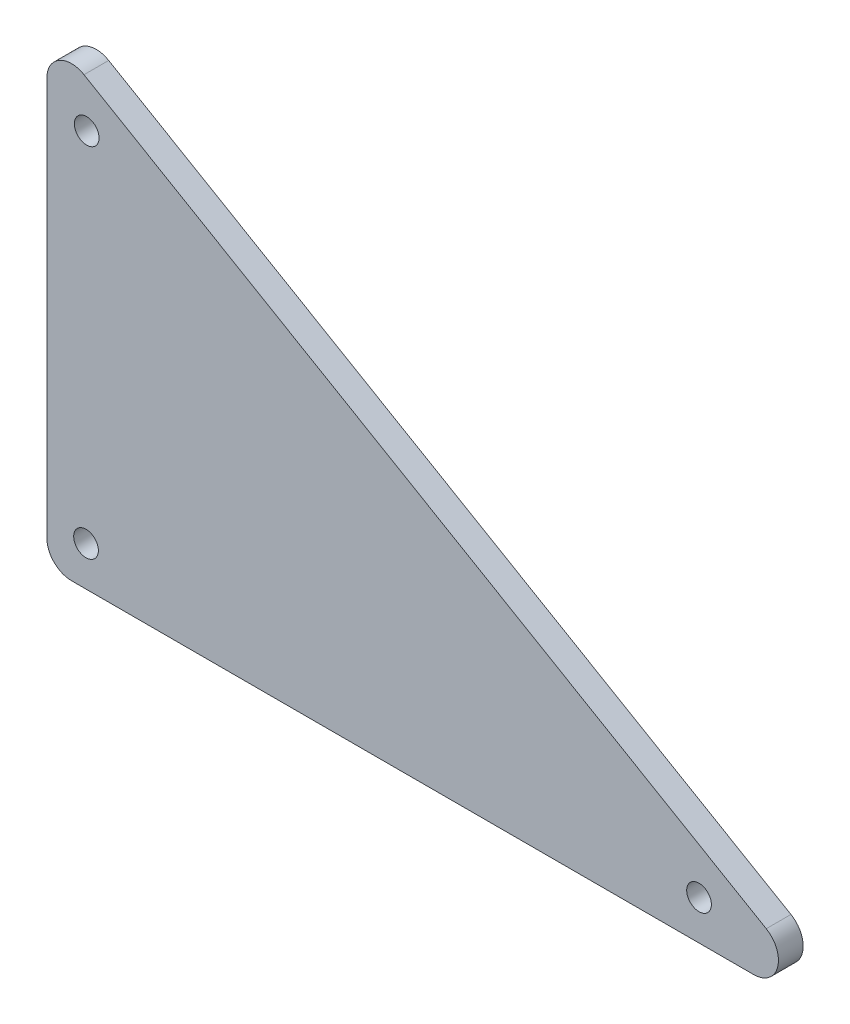
ISO-10303-21;
HEADER;
FILE_DESCRIPTION(('STEP AP214'),'2;1');
FILE_NAME('part.step','',(''),(''),'','','');
FILE_SCHEMA(('AUTOMOTIVE_DESIGN { 1 0 10303 214 1 1 1 1 }'));
ENDSEC;
DATA;
#1=APPLICATION_CONTEXT('core data for automotive mechanical design processes');
#2=APPLICATION_PROTOCOL_DEFINITION('international standard','automotive_design',2000,#1);
#3=PRODUCT_CONTEXT('',#1,'mechanical');
#4=PRODUCT('Part','Part','',(#3));
#5=PRODUCT_RELATED_PRODUCT_CATEGORY('part','',(#4));
#6=PRODUCT_DEFINITION_FORMATION('','',#4);
#7=PRODUCT_DEFINITION_CONTEXT('part definition',#1,'design');
#8=PRODUCT_DEFINITION('design','',#6,#7);
#9=PRODUCT_DEFINITION_SHAPE('','',#8);
#10=(LENGTH_UNIT() NAMED_UNIT(*) SI_UNIT(.MILLI.,.METRE.));
#11=(NAMED_UNIT(*) PLANE_ANGLE_UNIT() SI_UNIT($,.RADIAN.));
#12=(NAMED_UNIT(*) SI_UNIT($,.STERADIAN.) SOLID_ANGLE_UNIT());
#13=UNCERTAINTY_MEASURE_WITH_UNIT(LENGTH_MEASURE(1.E-05),#10,'distance_accuracy_value','');
#14=(GEOMETRIC_REPRESENTATION_CONTEXT(3) GLOBAL_UNCERTAINTY_ASSIGNED_CONTEXT((#13)) GLOBAL_UNIT_ASSIGNED_CONTEXT((#10,
#11,#12)) REPRESENTATION_CONTEXT('',''));
#15=CARTESIAN_POINT('',(0.,0.,0.));
#16=DIRECTION('',(0.,0.,1.));
#17=DIRECTION('',(1.,0.,0.));
#18=AXIS2_PLACEMENT_3D('',#15,#16,#17);
#19=CARTESIAN_POINT('',(0.,0.,5.));
#20=DIRECTION('',(0.,0.,1.));
#21=DIRECTION('',(1.,0.,0.));
#22=AXIS2_PLACEMENT_3D('',#19,#20,#21);
#23=PLANE('',#22);
#24=CARTESIAN_POINT('',(-73.2752494825146,-43.9732804687067,5.));
#25=DIRECTION('',(0.,0.,1.));
#26=DIRECTION('',(1.,0.,0.));
#27=AXIS2_PLACEMENT_3D('',#24,#25,#26);
#28=CIRCLE('',#27,2.50000000000001);
#29=CARTESIAN_POINT('',(-70.7752494825146,-43.9732804687067,5.));
#30=VERTEX_POINT('',#29);
#31=EDGE_CURVE('E283',#30,#30,#28,.T.);
#32=ORIENTED_EDGE('',*,*,#31,.F.);
#33=EDGE_LOOP('',(#32));
#34=FACE_BOUND('',#33,.T.);
#35=DIRECTION('',(0.,-1.,0.));
#36=VECTOR('',#35,1.);
#37=CARTESIAN_POINT('',(-81.2087316427934,-51.9739675162871,5.));
#38=LINE('',#37,#36);
#39=CARTESIAN_POINT('',(-81.2087316427934,33.7220519318444,5.));
#40=VERTEX_POINT('',#39);
#41=CARTESIAN_POINT('',(-81.2087316427934,-46.9739675162871,5.));
#42=VERTEX_POINT('',#41);
#43=EDGE_CURVE('E121',#40,#42,#38,.T.);
#44=ORIENTED_EDGE('',*,*,#43,.T.);
#45=CARTESIAN_POINT('',(-76.2087316427934,-46.9739675162871,5.));
#46=DIRECTION('',(0.,0.,1.));
#47=DIRECTION('',(1.,0.,0.));
#48=AXIS2_PLACEMENT_3D('',#45,#46,#47);
#49=CIRCLE('',#48,5.);
#50=CARTESIAN_POINT('',(-76.2087316427934,-51.9739675162871,5.));
#51=VERTEX_POINT('',#50);
#52=EDGE_CURVE('E137',#42,#51,#49,.T.);
#53=ORIENTED_EDGE('',*,*,#52,.T.);
#54=DIRECTION('',(1.,0.,0.));
#55=VECTOR('',#54,1.);
#56=CARTESIAN_POINT('',(80.4246140167158,-51.9739675162872,5.));
#57=LINE('',#56,#55);
#58=CARTESIAN_POINT('',(61.9504345109476,-51.9739675162872,5.));
#59=VERTEX_POINT('',#58);
#60=EDGE_CURVE('E111',#51,#59,#57,.T.);
#61=ORIENTED_EDGE('',*,*,#60,.T.);
#62=CARTESIAN_POINT('',(61.9504345109476,-46.9739675162872,5.));
#63=DIRECTION('',(0.,0.,1.));
#64=DIRECTION('',(1.,0.,0.));
#65=AXIS2_PLACEMENT_3D('',#62,#63,#64);
#66=CIRCLE('',#65,5.);
#67=CARTESIAN_POINT('',(64.4721948340449,-42.6564769404026,5.));
#68=VERTEX_POINT('',#67);
#69=EDGE_CURVE('E59',#59,#68,#66,.T.);
#70=ORIENTED_EDGE('',*,*,#69,.T.);
#71=DIRECTION('',(-0.86349811517692,0.504352064619455,0.));
#72=VECTOR('',#71,1.);
#73=CARTESIAN_POINT('',(-81.2087316427934,42.4328530220774,5.));
#74=LINE('',#73,#72);
#75=CARTESIAN_POINT('',(-73.6869713196961,38.039542507729,5.));
#76=VERTEX_POINT('',#75);
#77=EDGE_CURVE('E127',#68,#76,#74,.T.);
#78=ORIENTED_EDGE('',*,*,#77,.T.);
#79=CARTESIAN_POINT('',(-76.2087316427934,33.7220519318444,5.));
#80=DIRECTION('',(0.,0.,1.));
#81=DIRECTION('',(1.,0.,0.));
#82=AXIS2_PLACEMENT_3D('',#79,#80,#81);
#83=CIRCLE('',#82,5.);
#84=EDGE_CURVE('E134',#76,#40,#83,.T.);
#85=ORIENTED_EDGE('',*,*,#84,.T.);
#86=EDGE_LOOP('',(#44,#53,#61,#70,#78,#85));
#87=FACE_BOUND('',#86,.T.);
#88=CARTESIAN_POINT('',(-73.1422138030721,28.4567195312933,5.));
#89=DIRECTION('',(0.,0.,1.));
#90=DIRECTION('',(1.,0.,0.));
#91=AXIS2_PLACEMENT_3D('',#88,#89,#90);
#92=CIRCLE('',#91,2.50000000000001);
#93=CARTESIAN_POINT('',(-70.6422138030721,28.4567195312933,5.));
#94=VERTEX_POINT('',#93);
#95=EDGE_CURVE('E123',#94,#94,#92,.T.);
#96=ORIENTED_EDGE('',*,*,#95,.F.);
#97=EDGE_LOOP('',(#96));
#98=FACE_BOUND('',#97,.T.);
#99=CARTESIAN_POINT('',(50.8647505174854,-43.9732804687067,5.));
#100=DIRECTION('',(0.,0.,1.));
#101=DIRECTION('',(1.,0.,0.));
#102=AXIS2_PLACEMENT_3D('',#99,#100,#101);
#103=CIRCLE('',#102,2.5);
#104=CARTESIAN_POINT('',(53.3647505174854,-43.9732804687067,5.));
#105=VERTEX_POINT('',#104);
#106=EDGE_CURVE('E274',#105,#105,#103,.T.);
#107=ORIENTED_EDGE('',*,*,#106,.F.);
#108=EDGE_LOOP('',(#107));
#109=FACE_BOUND('',#108,.T.);
#110=ADVANCED_FACE('F38',(#34,#87,#98,#109),#23,.T.);
#111=CARTESIAN_POINT('',(0.,0.,0.));
#112=DIRECTION('',(0.,0.,1.));
#113=DIRECTION('',(1.,0.,0.));
#114=AXIS2_PLACEMENT_3D('',#111,#112,#113);
#115=PLANE('',#114);
#116=DIRECTION('',(1.,0.,0.));
#117=VECTOR('',#116,1.);
#118=CARTESIAN_POINT('',(80.4246140167158,-51.9739675162872,0.));
#119=LINE('',#118,#117);
#120=CARTESIAN_POINT('',(-76.2087316427934,-51.9739675162871,0.));
#121=VERTEX_POINT('',#120);
#122=CARTESIAN_POINT('',(61.9504345109476,-51.9739675162872,0.));
#123=VERTEX_POINT('',#122);
#124=EDGE_CURVE('E109',#121,#123,#119,.T.);
#125=ORIENTED_EDGE('',*,*,#124,.F.);
#126=CARTESIAN_POINT('',(-76.2087316427934,-46.9739675162871,0.));
#127=DIRECTION('',(0.,0.,1.));
#128=DIRECTION('',(1.,0.,0.));
#129=AXIS2_PLACEMENT_3D('',#126,#127,#128);
#130=CIRCLE('',#129,5.);
#131=CARTESIAN_POINT('',(-81.2087316427934,-46.9739675162871,0.));
#132=VERTEX_POINT('',#131);
#133=EDGE_CURVE('E92',#121,#132,#130,.F.);
#134=ORIENTED_EDGE('',*,*,#133,.T.);
#135=DIRECTION('',(0.,-1.,0.));
#136=VECTOR('',#135,1.);
#137=CARTESIAN_POINT('',(-81.2087316427934,-51.9739675162871,0.));
#138=LINE('',#137,#136);
#139=CARTESIAN_POINT('',(-81.2087316427934,33.7220519318444,0.));
#140=VERTEX_POINT('',#139);
#141=EDGE_CURVE('E119',#140,#132,#138,.T.);
#142=ORIENTED_EDGE('',*,*,#141,.F.);
#143=CARTESIAN_POINT('',(-76.2087316427934,33.7220519318444,0.));
#144=DIRECTION('',(0.,0.,1.));
#145=DIRECTION('',(1.,0.,0.));
#146=AXIS2_PLACEMENT_3D('',#143,#144,#145);
#147=CIRCLE('',#146,5.);
#148=CARTESIAN_POINT('',(-73.6869713196961,38.039542507729,0.));
#149=VERTEX_POINT('',#148);
#150=EDGE_CURVE('E112',#140,#149,#147,.F.);
#151=ORIENTED_EDGE('',*,*,#150,.T.);
#152=DIRECTION('',(-0.86349811517692,0.504352064619455,0.));
#153=VECTOR('',#152,1.);
#154=CARTESIAN_POINT('',(-81.2087316427934,42.4328530220774,0.));
#155=LINE('',#154,#153);
#156=CARTESIAN_POINT('',(64.4721948340449,-42.6564769404026,0.));
#157=VERTEX_POINT('',#156);
#158=EDGE_CURVE('E118',#157,#149,#155,.T.);
#159=ORIENTED_EDGE('',*,*,#158,.F.);
#160=CARTESIAN_POINT('',(61.9504345109476,-46.9739675162872,0.));
#161=DIRECTION('',(0.,0.,1.));
#162=DIRECTION('',(1.,0.,0.));
#163=AXIS2_PLACEMENT_3D('',#160,#161,#162);
#164=CIRCLE('',#163,5.);
#165=EDGE_CURVE('E103',#157,#123,#164,.F.);
#166=ORIENTED_EDGE('',*,*,#165,.T.);
#167=EDGE_LOOP('',(#125,#134,#142,#151,#159,#166));
#168=FACE_BOUND('',#167,.T.);
#169=CARTESIAN_POINT('',(-73.1422138030721,28.4567195312933,0.));
#170=DIRECTION('',(0.,0.,1.));
#171=DIRECTION('',(1.,0.,0.));
#172=AXIS2_PLACEMENT_3D('',#169,#170,#171);
#173=CIRCLE('',#172,2.50000000000001);
#174=CARTESIAN_POINT('',(-70.6422138030721,28.4567195312933,0.));
#175=VERTEX_POINT('',#174);
#176=EDGE_CURVE('E147',#175,#175,#173,.T.);
#177=ORIENTED_EDGE('',*,*,#176,.T.);
#178=EDGE_LOOP('',(#177));
#179=FACE_BOUND('',#178,.T.);
#180=CARTESIAN_POINT('',(-73.2752494825146,-43.9732804687067,0.));
#181=DIRECTION('',(0.,0.,1.));
#182=DIRECTION('',(1.,0.,0.));
#183=AXIS2_PLACEMENT_3D('',#180,#181,#182);
#184=CIRCLE('',#183,2.50000000000001);
#185=CARTESIAN_POINT('',(-70.7752494825146,-43.9732804687067,0.));
#186=VERTEX_POINT('',#185);
#187=EDGE_CURVE('E280',#186,#186,#184,.T.);
#188=ORIENTED_EDGE('',*,*,#187,.T.);
#189=EDGE_LOOP('',(#188));
#190=FACE_BOUND('',#189,.T.);
#191=CARTESIAN_POINT('',(50.8647505174854,-43.9732804687067,0.));
#192=DIRECTION('',(0.,0.,1.));
#193=DIRECTION('',(1.,0.,0.));
#194=AXIS2_PLACEMENT_3D('',#191,#192,#193);
#195=CIRCLE('',#194,2.5);
#196=CARTESIAN_POINT('',(53.3647505174854,-43.9732804687067,0.));
#197=VERTEX_POINT('',#196);
#198=EDGE_CURVE('E277',#197,#197,#195,.T.);
#199=ORIENTED_EDGE('',*,*,#198,.T.);
#200=EDGE_LOOP('',(#199));
#201=FACE_BOUND('',#200,.T.);
#202=ADVANCED_FACE('F115',(#168,#179,#190,#201),#115,.F.);
#203=CARTESIAN_POINT('',(-81.2087316427934,-51.9739675162871,5.));
#204=DIRECTION('',(1.,0.,0.));
#205=DIRECTION('',(0.,1.,0.));
#206=AXIS2_PLACEMENT_3D('',#203,#204,#205);
#207=PLANE('',#206);
#208=ORIENTED_EDGE('',*,*,#141,.T.);
#209=DIRECTION('',(0.,0.,-1.));
#210=VECTOR('',#209,1.);
#211=CARTESIAN_POINT('',(-81.2087316427934,-46.9739675162871,5.));
#212=LINE('',#211,#210);
#213=EDGE_CURVE('E97',#132,#42,#212,.F.);
#214=ORIENTED_EDGE('',*,*,#213,.T.);
#215=ORIENTED_EDGE('',*,*,#43,.F.);
#216=DIRECTION('',(0.,0.,-1.));
#217=VECTOR('',#216,1.);
#218=CARTESIAN_POINT('',(-81.2087316427934,33.7220519318444,5.));
#219=LINE('',#218,#217);
#220=EDGE_CURVE('E102',#40,#140,#219,.T.);
#221=ORIENTED_EDGE('',*,*,#220,.T.);
#222=EDGE_LOOP('',(#208,#214,#215,#221));
#223=FACE_BOUND('',#222,.T.);
#224=ADVANCED_FACE('F151',(#223),#207,.F.);
#225=CARTESIAN_POINT('',(80.4246140167158,-51.9739675162872,5.));
#226=DIRECTION('',(0.,1.,0.));
#227=DIRECTION('',(-1.,0.,0.));
#228=AXIS2_PLACEMENT_3D('',#225,#226,#227);
#229=PLANE('',#228);
#230=ORIENTED_EDGE('',*,*,#60,.F.);
#231=DIRECTION('',(0.,0.,-1.));
#232=VECTOR('',#231,1.);
#233=CARTESIAN_POINT('',(-76.2087316427934,-51.9739675162871,5.));
#234=LINE('',#233,#232);
#235=EDGE_CURVE('E96',#51,#121,#234,.T.);
#236=ORIENTED_EDGE('',*,*,#235,.T.);
#237=ORIENTED_EDGE('',*,*,#124,.T.);
#238=DIRECTION('',(0.,0.,-1.));
#239=VECTOR('',#238,1.);
#240=CARTESIAN_POINT('',(61.9504345109476,-51.9739675162872,5.));
#241=LINE('',#240,#239);
#242=EDGE_CURVE('E113',#123,#59,#241,.F.);
#243=ORIENTED_EDGE('',*,*,#242,.T.);
#244=EDGE_LOOP('',(#230,#236,#237,#243));
#245=FACE_BOUND('',#244,.T.);
#246=ADVANCED_FACE('F108',(#245),#229,.F.);
#247=CARTESIAN_POINT('',(-81.2087316427934,42.4328530220774,5.));
#248=DIRECTION('',(-0.504352064619455,-0.86349811517692,0.));
#249=DIRECTION('',(0.86349811517692,-0.504352064619455,0.));
#250=AXIS2_PLACEMENT_3D('',#247,#248,#249);
#251=PLANE('',#250);
#252=ORIENTED_EDGE('',*,*,#77,.F.);
#253=DIRECTION('',(0.,0.,-1.));
#254=VECTOR('',#253,1.);
#255=CARTESIAN_POINT('',(64.4721948340449,-42.6564769404026,5.));
#256=LINE('',#255,#254);
#257=EDGE_CURVE('E11',#68,#157,#256,.T.);
#258=ORIENTED_EDGE('',*,*,#257,.T.);
#259=ORIENTED_EDGE('',*,*,#158,.T.);
#260=DIRECTION('',(0.,0.,-1.));
#261=VECTOR('',#260,1.);
#262=CARTESIAN_POINT('',(-73.6869713196961,38.039542507729,5.));
#263=LINE('',#262,#261);
#264=EDGE_CURVE('E46',#149,#76,#263,.F.);
#265=ORIENTED_EDGE('',*,*,#264,.T.);
#266=EDGE_LOOP('',(#252,#258,#259,#265));
#267=FACE_BOUND('',#266,.T.);
#268=ADVANCED_FACE('F152',(#267),#251,.F.);
#269=CARTESIAN_POINT('',(-73.1422138030721,28.4567195312933,5.));
#270=DIRECTION('',(0.,0.,-1.));
#271=DIRECTION('',(-1.,0.,0.));
#272=AXIS2_PLACEMENT_3D('',#269,#270,#271);
#273=CYLINDRICAL_SURFACE('',#272,2.50000000000001);
#274=ORIENTED_EDGE('',*,*,#95,.T.);
#275=EDGE_LOOP('',(#274));
#276=FACE_BOUND('',#275,.T.);
#277=ORIENTED_EDGE('',*,*,#176,.F.);
#278=EDGE_LOOP('',(#277));
#279=FACE_BOUND('',#278,.T.);
#280=ADVANCED_FACE('F171',(#276,#279),#273,.F.);
#281=CARTESIAN_POINT('',(-73.2752494825146,-43.9732804687067,5.));
#282=DIRECTION('',(0.,0.,-1.));
#283=DIRECTION('',(-1.,0.,0.));
#284=AXIS2_PLACEMENT_3D('',#281,#282,#283);
#285=CYLINDRICAL_SURFACE('',#284,2.50000000000001);
#286=ORIENTED_EDGE('',*,*,#31,.T.);
#287=EDGE_LOOP('',(#286));
#288=FACE_BOUND('',#287,.T.);
#289=ORIENTED_EDGE('',*,*,#187,.F.);
#290=EDGE_LOOP('',(#289));
#291=FACE_BOUND('',#290,.T.);
#292=ADVANCED_FACE('F198',(#288,#291),#285,.F.);
#293=CARTESIAN_POINT('',(50.8647505174854,-43.9732804687067,5.));
#294=DIRECTION('',(0.,0.,-1.));
#295=DIRECTION('',(-1.,0.,0.));
#296=AXIS2_PLACEMENT_3D('',#293,#294,#295);
#297=CYLINDRICAL_SURFACE('',#296,2.5);
#298=ORIENTED_EDGE('',*,*,#106,.T.);
#299=EDGE_LOOP('',(#298));
#300=FACE_BOUND('',#299,.T.);
#301=ORIENTED_EDGE('',*,*,#198,.F.);
#302=EDGE_LOOP('',(#301));
#303=FACE_BOUND('',#302,.T.);
#304=ADVANCED_FACE('F160',(#300,#303),#297,.F.);
#305=CARTESIAN_POINT('',(-76.2087316427934,-46.9739675162871,5.));
#306=DIRECTION('',(0.,0.,-1.));
#307=DIRECTION('',(-1.,0.,0.));
#308=AXIS2_PLACEMENT_3D('',#305,#306,#307);
#309=CYLINDRICAL_SURFACE('',#308,5.);
#310=ORIENTED_EDGE('',*,*,#52,.F.);
#311=ORIENTED_EDGE('',*,*,#213,.F.);
#312=ORIENTED_EDGE('',*,*,#133,.F.);
#313=ORIENTED_EDGE('',*,*,#235,.F.);
#314=EDGE_LOOP('',(#310,#311,#312,#313));
#315=FACE_BOUND('',#314,.T.);
#316=ADVANCED_FACE('F95',(#315),#309,.T.);
#317=CARTESIAN_POINT('',(61.9504345109476,-46.9739675162872,5.));
#318=DIRECTION('',(0.,0.,-1.));
#319=DIRECTION('',(-1.,0.,0.));
#320=AXIS2_PLACEMENT_3D('',#317,#318,#319);
#321=CYLINDRICAL_SURFACE('',#320,5.);
#322=ORIENTED_EDGE('',*,*,#69,.F.);
#323=ORIENTED_EDGE('',*,*,#242,.F.);
#324=ORIENTED_EDGE('',*,*,#165,.F.);
#325=ORIENTED_EDGE('',*,*,#257,.F.);
#326=EDGE_LOOP('',(#322,#323,#324,#325));
#327=FACE_BOUND('',#326,.T.);
#328=ADVANCED_FACE('F154',(#327),#321,.T.);
#329=CARTESIAN_POINT('',(-76.2087316427934,33.7220519318444,5.));
#330=DIRECTION('',(0.,0.,-1.));
#331=DIRECTION('',(-1.,0.,0.));
#332=AXIS2_PLACEMENT_3D('',#329,#330,#331);
#333=CYLINDRICAL_SURFACE('',#332,5.);
#334=ORIENTED_EDGE('',*,*,#84,.F.);
#335=ORIENTED_EDGE('',*,*,#264,.F.);
#336=ORIENTED_EDGE('',*,*,#150,.F.);
#337=ORIENTED_EDGE('',*,*,#220,.F.);
#338=EDGE_LOOP('',(#334,#335,#336,#337));
#339=FACE_BOUND('',#338,.T.);
#340=ADVANCED_FACE('F40',(#339),#333,.T.);
#341=CLOSED_SHELL('',(#110,#202,#224,#246,#268,#280,#292,#304,#316,#328,#340));
#342=MANIFOLD_SOLID_BREP('B2',#341);
#343=ADVANCED_BREP_SHAPE_REPRESENTATION('',(#18,#342),#14);
#344=SHAPE_DEFINITION_REPRESENTATION(#9,#343);
ENDSEC;
END-ISO-10303-21;
